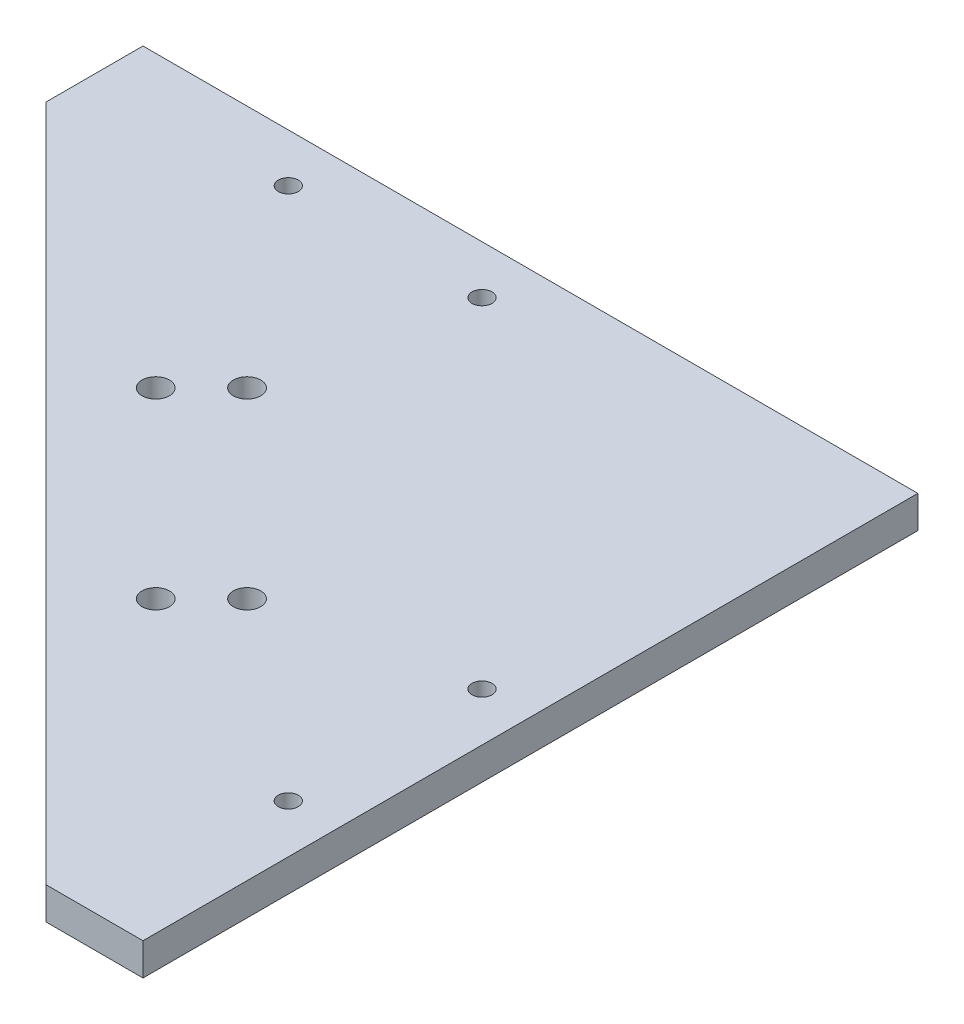
ISO-10303-21;
HEADER;
FILE_DESCRIPTION(('STEP AP214'),'2;1');
FILE_NAME('part.step','',(''),(''),'','','');
FILE_SCHEMA(('AUTOMOTIVE_DESIGN { 1 0 10303 214 1 1 1 1 }'));
ENDSEC;
DATA;
#1=APPLICATION_CONTEXT('core data for automotive mechanical design processes');
#2=APPLICATION_PROTOCOL_DEFINITION('international standard','automotive_design',2000,#1);
#3=PRODUCT_CONTEXT('',#1,'mechanical');
#4=PRODUCT('Part','Part','',(#3));
#5=PRODUCT_RELATED_PRODUCT_CATEGORY('part','',(#4));
#6=PRODUCT_DEFINITION_FORMATION('','',#4);
#7=PRODUCT_DEFINITION_CONTEXT('part definition',#1,'design');
#8=PRODUCT_DEFINITION('design','',#6,#7);
#9=PRODUCT_DEFINITION_SHAPE('','',#8);
#10=(LENGTH_UNIT() NAMED_UNIT(*) SI_UNIT(.MILLI.,.METRE.));
#11=(NAMED_UNIT(*) PLANE_ANGLE_UNIT() SI_UNIT($,.RADIAN.));
#12=(NAMED_UNIT(*) SI_UNIT($,.STERADIAN.) SOLID_ANGLE_UNIT());
#13=UNCERTAINTY_MEASURE_WITH_UNIT(LENGTH_MEASURE(1.E-05),#10,'distance_accuracy_value','');
#14=(GEOMETRIC_REPRESENTATION_CONTEXT(3) GLOBAL_UNCERTAINTY_ASSIGNED_CONTEXT((#13)) GLOBAL_UNIT_ASSIGNED_CONTEXT((#10,
#11,#12)) REPRESENTATION_CONTEXT('',''));
#15=CARTESIAN_POINT('',(0.,0.,0.));
#16=DIRECTION('',(0.,0.,1.));
#17=DIRECTION('',(1.,0.,0.));
#18=AXIS2_PLACEMENT_3D('',#15,#16,#17);
#19=CARTESIAN_POINT('',(0.,5.,0.));
#20=DIRECTION('',(-1.,0.,0.));
#21=DIRECTION('',(0.,0.,1.));
#22=AXIS2_PLACEMENT_3D('',#19,#20,#21);
#23=PLANE('',#22);
#24=DIRECTION('',(0.,0.,-1.));
#25=VECTOR('',#24,1.);
#26=CARTESIAN_POINT('',(0.,0.,0.));
#27=LINE('',#26,#25);
#28=CARTESIAN_POINT('',(0.,0.,120.));
#29=VERTEX_POINT('',#28);
#30=CARTESIAN_POINT('',(0.,0.,0.));
#31=VERTEX_POINT('',#30);
#32=EDGE_CURVE('E121',#29,#31,#27,.T.);
#33=ORIENTED_EDGE('',*,*,#32,.T.);
#34=DIRECTION('',(0.,-1.,0.));
#35=VECTOR('',#34,1.);
#36=CARTESIAN_POINT('',(0.,5.,0.));
#37=LINE('',#36,#35);
#38=CARTESIAN_POINT('',(0.,5.,0.));
#39=VERTEX_POINT('',#38);
#40=EDGE_CURVE('E11',#39,#31,#37,.T.);
#41=ORIENTED_EDGE('',*,*,#40,.F.);
#42=DIRECTION('',(0.,0.,-1.));
#43=VECTOR('',#42,1.);
#44=CARTESIAN_POINT('',(0.,5.,0.));
#45=LINE('',#44,#43);
#46=CARTESIAN_POINT('',(0.,5.,120.));
#47=VERTEX_POINT('',#46);
#48=EDGE_CURVE('E135',#47,#39,#45,.T.);
#49=ORIENTED_EDGE('',*,*,#48,.F.);
#50=DIRECTION('',(0.,-1.,0.));
#51=VECTOR('',#50,1.);
#52=CARTESIAN_POINT('',(0.,5.,120.));
#53=LINE('',#52,#51);
#54=EDGE_CURVE('E117',#47,#29,#53,.T.);
#55=ORIENTED_EDGE('',*,*,#54,.T.);
#56=EDGE_LOOP('',(#33,#41,#49,#55));
#57=FACE_BOUND('',#56,.T.);
#58=ADVANCED_FACE('F40',(#57),#23,.F.);
#59=CARTESIAN_POINT('',(0.,5.,0.));
#60=DIRECTION('',(0.,0.,1.));
#61=DIRECTION('',(1.,0.,0.));
#62=AXIS2_PLACEMENT_3D('',#59,#60,#61);
#63=PLANE('',#62);
#64=DIRECTION('',(-1.,0.,0.));
#65=VECTOR('',#64,1.);
#66=CARTESIAN_POINT('',(0.,0.,0.));
#67=LINE('',#66,#65);
#68=CARTESIAN_POINT('',(-120.,0.,0.));
#69=VERTEX_POINT('',#68);
#70=EDGE_CURVE('E125',#31,#69,#67,.T.);
#71=ORIENTED_EDGE('',*,*,#70,.T.);
#72=DIRECTION('',(0.,-1.,0.));
#73=VECTOR('',#72,1.);
#74=CARTESIAN_POINT('',(-120.,5.,0.));
#75=LINE('',#74,#73);
#76=CARTESIAN_POINT('',(-120.,5.,0.));
#77=VERTEX_POINT('',#76);
#78=EDGE_CURVE('E49',#77,#69,#75,.T.);
#79=ORIENTED_EDGE('',*,*,#78,.F.);
#80=DIRECTION('',(-1.,0.,0.));
#81=VECTOR('',#80,1.);
#82=CARTESIAN_POINT('',(0.,5.,0.));
#83=LINE('',#82,#81);
#84=EDGE_CURVE('E91',#39,#77,#83,.T.);
#85=ORIENTED_EDGE('',*,*,#84,.F.);
#86=ORIENTED_EDGE('',*,*,#40,.T.);
#87=EDGE_LOOP('',(#71,#79,#85,#86));
#88=FACE_BOUND('',#87,.T.);
#89=ADVANCED_FACE('F158',(#88),#63,.F.);
#90=CARTESIAN_POINT('',(-120.,5.,0.));
#91=DIRECTION('',(1.,0.,0.));
#92=DIRECTION('',(0.,0.,-1.));
#93=AXIS2_PLACEMENT_3D('',#90,#91,#92);
#94=PLANE('',#93);
#95=DIRECTION('',(0.,0.,1.));
#96=VECTOR('',#95,1.);
#97=CARTESIAN_POINT('',(-120.,0.,0.));
#98=LINE('',#97,#96);
#99=CARTESIAN_POINT('',(-120.,0.,15.));
#100=VERTEX_POINT('',#99);
#101=EDGE_CURVE('E107',#69,#100,#98,.T.);
#102=ORIENTED_EDGE('',*,*,#101,.T.);
#103=DIRECTION('',(0.,-1.,0.));
#104=VECTOR('',#103,1.);
#105=CARTESIAN_POINT('',(-120.,5.,15.));
#106=LINE('',#105,#104);
#107=CARTESIAN_POINT('',(-120.,5.,15.));
#108=VERTEX_POINT('',#107);
#109=EDGE_CURVE('E104',#108,#100,#106,.T.);
#110=ORIENTED_EDGE('',*,*,#109,.F.);
#111=DIRECTION('',(0.,0.,1.));
#112=VECTOR('',#111,1.);
#113=CARTESIAN_POINT('',(-120.,5.,0.));
#114=LINE('',#113,#112);
#115=EDGE_CURVE('E95',#77,#108,#114,.T.);
#116=ORIENTED_EDGE('',*,*,#115,.F.);
#117=ORIENTED_EDGE('',*,*,#78,.T.);
#118=EDGE_LOOP('',(#102,#110,#116,#117));
#119=FACE_BOUND('',#118,.T.);
#120=ADVANCED_FACE('F105',(#119),#94,.F.);
#121=CARTESIAN_POINT('',(-120.,5.,15.));
#122=DIRECTION('',(0.707106781186547,0.,-0.707106781186548));
#123=DIRECTION('',(-0.707106781186548,0.,-0.707106781186547));
#124=AXIS2_PLACEMENT_3D('',#121,#122,#123);
#125=PLANE('',#124);
#126=DIRECTION('',(0.707106781186548,0.,0.707106781186547));
#127=VECTOR('',#126,1.);
#128=CARTESIAN_POINT('',(-120.,0.,15.));
#129=LINE('',#128,#127);
#130=CARTESIAN_POINT('',(-15.,0.,120.));
#131=VERTEX_POINT('',#130);
#132=EDGE_CURVE('E77',#100,#131,#129,.T.);
#133=ORIENTED_EDGE('',*,*,#132,.T.);
#134=DIRECTION('',(0.,-1.,0.));
#135=VECTOR('',#134,1.);
#136=CARTESIAN_POINT('',(-15.,5.,120.));
#137=LINE('',#136,#135);
#138=CARTESIAN_POINT('',(-15.,5.,120.));
#139=VERTEX_POINT('',#138);
#140=EDGE_CURVE('E109',#139,#131,#137,.T.);
#141=ORIENTED_EDGE('',*,*,#140,.F.);
#142=DIRECTION('',(0.707106781186548,0.,0.707106781186547));
#143=VECTOR('',#142,1.);
#144=CARTESIAN_POINT('',(-120.,5.,15.));
#145=LINE('',#144,#143);
#146=EDGE_CURVE('E99',#108,#139,#145,.T.);
#147=ORIENTED_EDGE('',*,*,#146,.F.);
#148=ORIENTED_EDGE('',*,*,#109,.T.);
#149=EDGE_LOOP('',(#133,#141,#147,#148));
#150=FACE_BOUND('',#149,.T.);
#151=ADVANCED_FACE('F111',(#150),#125,.F.);
#152=CARTESIAN_POINT('',(0.,5.,120.));
#153=DIRECTION('',(0.,0.,-1.));
#154=DIRECTION('',(-1.,0.,0.));
#155=AXIS2_PLACEMENT_3D('',#152,#153,#154);
#156=PLANE('',#155);
#157=DIRECTION('',(1.,0.,0.));
#158=VECTOR('',#157,1.);
#159=CARTESIAN_POINT('',(0.,0.,120.));
#160=LINE('',#159,#158);
#161=EDGE_CURVE('E83',#131,#29,#160,.T.);
#162=ORIENTED_EDGE('',*,*,#161,.T.);
#163=ORIENTED_EDGE('',*,*,#54,.F.);
#164=DIRECTION('',(1.,0.,0.));
#165=VECTOR('',#164,1.);
#166=CARTESIAN_POINT('',(0.,5.,120.));
#167=LINE('',#166,#165);
#168=EDGE_CURVE('E57',#139,#47,#167,.T.);
#169=ORIENTED_EDGE('',*,*,#168,.F.);
#170=ORIENTED_EDGE('',*,*,#140,.T.);
#171=EDGE_LOOP('',(#162,#163,#169,#170));
#172=FACE_BOUND('',#171,.T.);
#173=ADVANCED_FACE('F146',(#172),#156,.F.);
#174=CARTESIAN_POINT('',(0.,5.,0.));
#175=DIRECTION('',(0.,-1.,0.));
#176=DIRECTION('',(0.,0.,-1.));
#177=AXIS2_PLACEMENT_3D('',#174,#175,#176);
#178=PLANE('',#177);
#179=CARTESIAN_POINT('',(-66.0857864376269,5.,37.801515190165));
#180=DIRECTION('',(0.,1.,0.));
#181=DIRECTION('',(0.,0.,1.));
#182=AXIS2_PLACEMENT_3D('',#179,#180,#181);
#183=CIRCLE('',#182,2.125);
#184=CARTESIAN_POINT('',(-66.0857864376269,5.,39.926515190165));
#185=VERTEX_POINT('',#184);
#186=EDGE_CURVE('E305',#185,#185,#183,.T.);
#187=ORIENTED_EDGE('',*,*,#186,.F.);
#188=EDGE_LOOP('',(#187));
#189=FACE_BOUND('',#188,.T.);
#190=CARTESIAN_POINT('',(-73.1568542494924,5.,44.8725830020305));
#191=DIRECTION('',(0.,1.,0.));
#192=DIRECTION('',(0.,0.,1.));
#193=AXIS2_PLACEMENT_3D('',#190,#191,#192);
#194=CIRCLE('',#193,2.125);
#195=CARTESIAN_POINT('',(-73.1568542494924,5.,46.9975830020305));
#196=VERTEX_POINT('',#195);
#197=EDGE_CURVE('E314',#196,#196,#194,.T.);
#198=ORIENTED_EDGE('',*,*,#197,.F.);
#199=EDGE_LOOP('',(#198));
#200=FACE_BOUND('',#199,.T.);
#201=CARTESIAN_POINT('',(-44.8725830020305,5.,73.1568542494924));
#202=DIRECTION('',(0.,1.,0.));
#203=DIRECTION('',(0.,0.,-1.));
#204=AXIS2_PLACEMENT_3D('',#201,#202,#203);
#205=CIRCLE('',#204,2.125);
#206=CARTESIAN_POINT('',(-44.8725830020305,5.,71.0318542494924));
#207=VERTEX_POINT('',#206);
#208=EDGE_CURVE('E323',#207,#207,#205,.T.);
#209=ORIENTED_EDGE('',*,*,#208,.F.);
#210=EDGE_LOOP('',(#209));
#211=FACE_BOUND('',#210,.T.);
#212=CARTESIAN_POINT('',(-37.801515190165,5.,66.0857864376269));
#213=DIRECTION('',(0.,1.,0.));
#214=DIRECTION('',(0.,0.,-1.));
#215=AXIS2_PLACEMENT_3D('',#212,#213,#214);
#216=CIRCLE('',#215,2.125);
#217=CARTESIAN_POINT('',(-37.801515190165,5.,63.9607864376269));
#218=VERTEX_POINT('',#217);
#219=EDGE_CURVE('E331',#218,#218,#216,.T.);
#220=ORIENTED_EDGE('',*,*,#219,.F.);
#221=EDGE_LOOP('',(#220));
#222=FACE_BOUND('',#221,.T.);
#223=CARTESIAN_POINT('',(-90.,5.,7.50000000000001));
#224=DIRECTION('',(0.,1.,0.));
#225=DIRECTION('',(0.,0.,1.));
#226=AXIS2_PLACEMENT_3D('',#223,#224,#225);
#227=CIRCLE('',#226,1.54999999999999);
#228=CARTESIAN_POINT('',(-90.,5.,9.05000000000001));
#229=VERTEX_POINT('',#228);
#230=EDGE_CURVE('E337',#229,#229,#227,.T.);
#231=ORIENTED_EDGE('',*,*,#230,.F.);
#232=EDGE_LOOP('',(#231));
#233=FACE_BOUND('',#232,.T.);
#234=CARTESIAN_POINT('',(-7.49999999999999,5.,60.));
#235=DIRECTION('',(0.,1.,0.));
#236=DIRECTION('',(0.,0.,1.));
#237=AXIS2_PLACEMENT_3D('',#234,#235,#236);
#238=CIRCLE('',#237,1.55);
#239=CARTESIAN_POINT('',(-7.49999999999999,5.,61.55));
#240=VERTEX_POINT('',#239);
#241=EDGE_CURVE('E311',#240,#240,#238,.T.);
#242=ORIENTED_EDGE('',*,*,#241,.F.);
#243=EDGE_LOOP('',(#242));
#244=FACE_BOUND('',#243,.T.);
#245=CARTESIAN_POINT('',(-7.49999999999999,5.,90.));
#246=DIRECTION('',(0.,1.,0.));
#247=DIRECTION('',(0.,0.,1.));
#248=AXIS2_PLACEMENT_3D('',#245,#246,#247);
#249=CIRCLE('',#248,1.55);
#250=CARTESIAN_POINT('',(-7.49999999999999,5.,91.55));
#251=VERTEX_POINT('',#250);
#252=EDGE_CURVE('E346',#251,#251,#249,.T.);
#253=ORIENTED_EDGE('',*,*,#252,.F.);
#254=EDGE_LOOP('',(#253));
#255=FACE_BOUND('',#254,.T.);
#256=CARTESIAN_POINT('',(-60.,5.,7.50000000000001));
#257=DIRECTION('',(0.,1.,0.));
#258=DIRECTION('',(0.,0.,1.));
#259=AXIS2_PLACEMENT_3D('',#256,#257,#258);
#260=CIRCLE('',#259,1.55);
#261=CARTESIAN_POINT('',(-60.,5.,9.05000000000001));
#262=VERTEX_POINT('',#261);
#263=EDGE_CURVE('E353',#262,#262,#260,.T.);
#264=ORIENTED_EDGE('',*,*,#263,.F.);
#265=EDGE_LOOP('',(#264));
#266=FACE_BOUND('',#265,.T.);
#267=ORIENTED_EDGE('',*,*,#48,.T.);
#268=ORIENTED_EDGE('',*,*,#84,.T.);
#269=ORIENTED_EDGE('',*,*,#115,.T.);
#270=ORIENTED_EDGE('',*,*,#146,.T.);
#271=ORIENTED_EDGE('',*,*,#168,.T.);
#272=EDGE_LOOP('',(#267,#268,#269,#270,#271));
#273=FACE_BOUND('',#272,.T.);
#274=ADVANCED_FACE('F97',(#189,#200,#211,#222,#233,#244,#255,#266,#273),#178,.F.);
#275=CARTESIAN_POINT('',(0.,0.,0.));
#276=DIRECTION('',(0.,-1.,0.));
#277=DIRECTION('',(0.,0.,-1.));
#278=AXIS2_PLACEMENT_3D('',#275,#276,#277);
#279=PLANE('',#278);
#280=CARTESIAN_POINT('',(-66.0857864376269,0.,37.801515190165));
#281=DIRECTION('',(0.,1.,0.));
#282=DIRECTION('',(0.,0.,1.));
#283=AXIS2_PLACEMENT_3D('',#280,#281,#282);
#284=CIRCLE('',#283,2.125);
#285=CARTESIAN_POINT('',(-66.0857864376269,0.,39.926515190165));
#286=VERTEX_POINT('',#285);
#287=EDGE_CURVE('E302',#286,#286,#284,.T.);
#288=ORIENTED_EDGE('',*,*,#287,.T.);
#289=EDGE_LOOP('',(#288));
#290=FACE_BOUND('',#289,.T.);
#291=CARTESIAN_POINT('',(-73.1568542494924,0.,44.8725830020305));
#292=DIRECTION('',(0.,1.,0.));
#293=DIRECTION('',(0.,0.,1.));
#294=AXIS2_PLACEMENT_3D('',#291,#292,#293);
#295=CIRCLE('',#294,2.125);
#296=CARTESIAN_POINT('',(-73.1568542494924,0.,46.9975830020305));
#297=VERTEX_POINT('',#296);
#298=EDGE_CURVE('E307',#297,#297,#295,.T.);
#299=ORIENTED_EDGE('',*,*,#298,.T.);
#300=EDGE_LOOP('',(#299));
#301=FACE_BOUND('',#300,.T.);
#302=CARTESIAN_POINT('',(-44.8725830020305,0.,73.1568542494924));
#303=DIRECTION('',(0.,1.,0.));
#304=DIRECTION('',(0.,0.,-1.));
#305=AXIS2_PLACEMENT_3D('',#302,#303,#304);
#306=CIRCLE('',#305,2.125);
#307=CARTESIAN_POINT('',(-44.8725830020305,0.,71.0318542494924));
#308=VERTEX_POINT('',#307);
#309=EDGE_CURVE('E319',#308,#308,#306,.T.);
#310=ORIENTED_EDGE('',*,*,#309,.T.);
#311=EDGE_LOOP('',(#310));
#312=FACE_BOUND('',#311,.T.);
#313=CARTESIAN_POINT('',(-37.801515190165,0.,66.0857864376269));
#314=DIRECTION('',(0.,1.,0.));
#315=DIRECTION('',(0.,0.,-1.));
#316=AXIS2_PLACEMENT_3D('',#313,#314,#315);
#317=CIRCLE('',#316,2.125);
#318=CARTESIAN_POINT('',(-37.801515190165,0.,63.9607864376269));
#319=VERTEX_POINT('',#318);
#320=EDGE_CURVE('E327',#319,#319,#317,.T.);
#321=ORIENTED_EDGE('',*,*,#320,.T.);
#322=EDGE_LOOP('',(#321));
#323=FACE_BOUND('',#322,.T.);
#324=CARTESIAN_POINT('',(-90.,0.,7.50000000000001));
#325=DIRECTION('',(0.,1.,0.));
#326=DIRECTION('',(0.,0.,1.));
#327=AXIS2_PLACEMENT_3D('',#324,#325,#326);
#328=CIRCLE('',#327,1.54999999999999);
#329=CARTESIAN_POINT('',(-90.,0.,9.05000000000001));
#330=VERTEX_POINT('',#329);
#331=EDGE_CURVE('E126',#330,#330,#328,.T.);
#332=ORIENTED_EDGE('',*,*,#331,.T.);
#333=EDGE_LOOP('',(#332));
#334=FACE_BOUND('',#333,.T.);
#335=CARTESIAN_POINT('',(-7.49999999999999,0.,60.));
#336=DIRECTION('',(0.,1.,0.));
#337=DIRECTION('',(0.,0.,1.));
#338=AXIS2_PLACEMENT_3D('',#335,#336,#337);
#339=CIRCLE('',#338,1.55);
#340=CARTESIAN_POINT('',(-7.49999999999999,0.,61.55));
#341=VERTEX_POINT('',#340);
#342=EDGE_CURVE('E342',#341,#341,#339,.T.);
#343=ORIENTED_EDGE('',*,*,#342,.T.);
#344=EDGE_LOOP('',(#343));
#345=FACE_BOUND('',#344,.T.);
#346=CARTESIAN_POINT('',(-7.49999999999999,0.,90.));
#347=DIRECTION('',(0.,1.,0.));
#348=DIRECTION('',(0.,0.,1.));
#349=AXIS2_PLACEMENT_3D('',#346,#347,#348);
#350=CIRCLE('',#349,1.55);
#351=CARTESIAN_POINT('',(-7.49999999999999,0.,91.55));
#352=VERTEX_POINT('',#351);
#353=EDGE_CURVE('E357',#352,#352,#350,.T.);
#354=ORIENTED_EDGE('',*,*,#353,.T.);
#355=EDGE_LOOP('',(#354));
#356=FACE_BOUND('',#355,.T.);
#357=CARTESIAN_POINT('',(-60.,0.,7.50000000000001));
#358=DIRECTION('',(0.,1.,0.));
#359=DIRECTION('',(0.,0.,1.));
#360=AXIS2_PLACEMENT_3D('',#357,#358,#359);
#361=CIRCLE('',#360,1.55);
#362=CARTESIAN_POINT('',(-60.,0.,9.05000000000001));
#363=VERTEX_POINT('',#362);
#364=EDGE_CURVE('E341',#363,#363,#361,.T.);
#365=ORIENTED_EDGE('',*,*,#364,.T.);
#366=EDGE_LOOP('',(#365));
#367=FACE_BOUND('',#366,.T.);
#368=ORIENTED_EDGE('',*,*,#32,.F.);
#369=ORIENTED_EDGE('',*,*,#161,.F.);
#370=ORIENTED_EDGE('',*,*,#132,.F.);
#371=ORIENTED_EDGE('',*,*,#101,.F.);
#372=ORIENTED_EDGE('',*,*,#70,.F.);
#373=EDGE_LOOP('',(#368,#369,#370,#371,#372));
#374=FACE_BOUND('',#373,.T.);
#375=ADVANCED_FACE('F142',(#290,#301,#312,#323,#334,#345,#356,#367,#374),#279,.T.);
#376=CARTESIAN_POINT('',(-60.,0.,7.50000000000001));
#377=DIRECTION('',(0.,1.,0.));
#378=DIRECTION('',(0.,0.,1.));
#379=AXIS2_PLACEMENT_3D('',#376,#377,#378);
#380=CYLINDRICAL_SURFACE('',#379,1.55);
#381=ORIENTED_EDGE('',*,*,#364,.F.);
#382=EDGE_LOOP('',(#381));
#383=FACE_BOUND('',#382,.T.);
#384=ORIENTED_EDGE('',*,*,#263,.T.);
#385=EDGE_LOOP('',(#384));
#386=FACE_BOUND('',#385,.T.);
#387=ADVANCED_FACE('F188',(#383,#386),#380,.F.);
#388=CARTESIAN_POINT('',(-7.49999999999999,0.,90.));
#389=DIRECTION('',(0.,1.,0.));
#390=DIRECTION('',(0.,0.,1.));
#391=AXIS2_PLACEMENT_3D('',#388,#389,#390);
#392=CYLINDRICAL_SURFACE('',#391,1.55);
#393=ORIENTED_EDGE('',*,*,#353,.F.);
#394=EDGE_LOOP('',(#393));
#395=FACE_BOUND('',#394,.T.);
#396=ORIENTED_EDGE('',*,*,#252,.T.);
#397=EDGE_LOOP('',(#396));
#398=FACE_BOUND('',#397,.T.);
#399=ADVANCED_FACE('F196',(#395,#398),#392,.F.);
#400=CARTESIAN_POINT('',(-7.49999999999999,0.,60.));
#401=DIRECTION('',(0.,1.,0.));
#402=DIRECTION('',(0.,0.,1.));
#403=AXIS2_PLACEMENT_3D('',#400,#401,#402);
#404=CYLINDRICAL_SURFACE('',#403,1.55);
#405=ORIENTED_EDGE('',*,*,#342,.F.);
#406=EDGE_LOOP('',(#405));
#407=FACE_BOUND('',#406,.T.);
#408=ORIENTED_EDGE('',*,*,#241,.T.);
#409=EDGE_LOOP('',(#408));
#410=FACE_BOUND('',#409,.T.);
#411=ADVANCED_FACE('F205',(#407,#410),#404,.F.);
#412=CARTESIAN_POINT('',(-90.,0.,7.50000000000001));
#413=DIRECTION('',(0.,1.,0.));
#414=DIRECTION('',(0.,0.,1.));
#415=AXIS2_PLACEMENT_3D('',#412,#413,#414);
#416=CYLINDRICAL_SURFACE('',#415,1.54999999999999);
#417=ORIENTED_EDGE('',*,*,#331,.F.);
#418=EDGE_LOOP('',(#417));
#419=FACE_BOUND('',#418,.T.);
#420=ORIENTED_EDGE('',*,*,#230,.T.);
#421=EDGE_LOOP('',(#420));
#422=FACE_BOUND('',#421,.T.);
#423=ADVANCED_FACE('F214',(#419,#422),#416,.F.);
#424=CARTESIAN_POINT('',(-37.801515190165,0.,66.0857864376269));
#425=DIRECTION('',(0.,1.,0.));
#426=DIRECTION('',(0.,0.,1.));
#427=AXIS2_PLACEMENT_3D('',#424,#425,#426);
#428=CYLINDRICAL_SURFACE('',#427,2.125);
#429=ORIENTED_EDGE('',*,*,#320,.F.);
#430=EDGE_LOOP('',(#429));
#431=FACE_BOUND('',#430,.T.);
#432=ORIENTED_EDGE('',*,*,#219,.T.);
#433=EDGE_LOOP('',(#432));
#434=FACE_BOUND('',#433,.T.);
#435=ADVANCED_FACE('F222',(#431,#434),#428,.F.);
#436=CARTESIAN_POINT('',(-44.8725830020305,0.,73.1568542494924));
#437=DIRECTION('',(0.,1.,0.));
#438=DIRECTION('',(0.,0.,1.));
#439=AXIS2_PLACEMENT_3D('',#436,#437,#438);
#440=CYLINDRICAL_SURFACE('',#439,2.125);
#441=ORIENTED_EDGE('',*,*,#309,.F.);
#442=EDGE_LOOP('',(#441));
#443=FACE_BOUND('',#442,.T.);
#444=ORIENTED_EDGE('',*,*,#208,.T.);
#445=EDGE_LOOP('',(#444));
#446=FACE_BOUND('',#445,.T.);
#447=ADVANCED_FACE('F230',(#443,#446),#440,.F.);
#448=CARTESIAN_POINT('',(-73.1568542494924,0.,44.8725830020305));
#449=DIRECTION('',(0.,1.,0.));
#450=DIRECTION('',(0.,0.,1.));
#451=AXIS2_PLACEMENT_3D('',#448,#449,#450);
#452=CYLINDRICAL_SURFACE('',#451,2.125);
#453=ORIENTED_EDGE('',*,*,#298,.F.);
#454=EDGE_LOOP('',(#453));
#455=FACE_BOUND('',#454,.T.);
#456=ORIENTED_EDGE('',*,*,#197,.T.);
#457=EDGE_LOOP('',(#456));
#458=FACE_BOUND('',#457,.T.);
#459=ADVANCED_FACE('F239',(#455,#458),#452,.F.);
#460=CARTESIAN_POINT('',(-66.0857864376269,0.,37.801515190165));
#461=DIRECTION('',(0.,1.,0.));
#462=DIRECTION('',(0.,0.,1.));
#463=AXIS2_PLACEMENT_3D('',#460,#461,#462);
#464=CYLINDRICAL_SURFACE('',#463,2.125);
#465=ORIENTED_EDGE('',*,*,#287,.F.);
#466=EDGE_LOOP('',(#465));
#467=FACE_BOUND('',#466,.T.);
#468=ORIENTED_EDGE('',*,*,#186,.T.);
#469=EDGE_LOOP('',(#468));
#470=FACE_BOUND('',#469,.T.);
#471=ADVANCED_FACE('F248',(#467,#470),#464,.F.);
#472=CLOSED_SHELL('',(#58,#89,#120,#151,#173,#274,#375,#387,#399,#411,#423,#435,#447,#459,#471));
#473=MANIFOLD_SOLID_BREP('B2',#472);
#474=ADVANCED_BREP_SHAPE_REPRESENTATION('',(#18,#473),#14);
#475=SHAPE_DEFINITION_REPRESENTATION(#9,#474);
ENDSEC;
END-ISO-10303-21;
